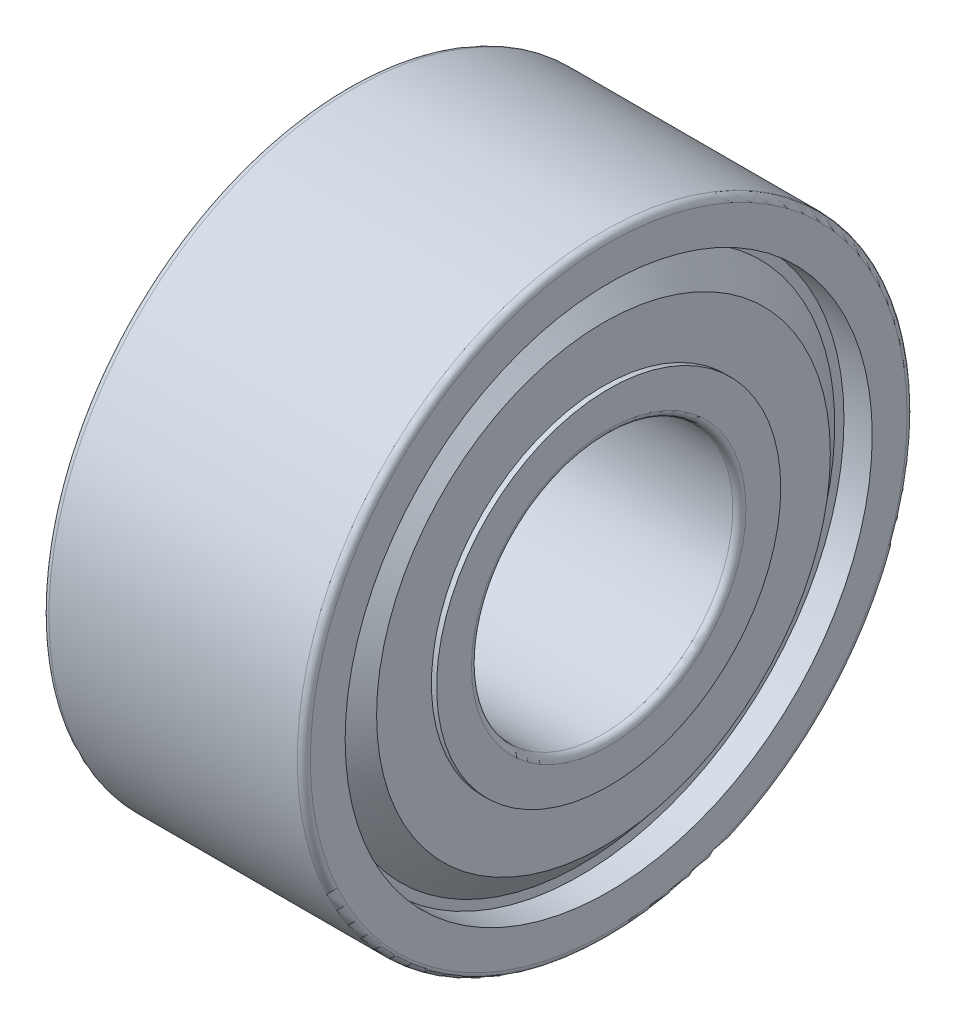
ISO-10303-21;
HEADER;
FILE_DESCRIPTION(('STEP AP214'),'2;1');
FILE_NAME('part.step','',(''),(''),'','','');
FILE_SCHEMA(('AUTOMOTIVE_DESIGN { 1 0 10303 214 1 1 1 1 }'));
ENDSEC;
DATA;
#1=APPLICATION_CONTEXT('core data for automotive mechanical design processes');
#2=APPLICATION_PROTOCOL_DEFINITION('international standard','automotive_design',2000,#1);
#3=PRODUCT_CONTEXT('',#1,'mechanical');
#4=PRODUCT('Part','Part','',(#3));
#5=PRODUCT_RELATED_PRODUCT_CATEGORY('part','',(#4));
#6=PRODUCT_DEFINITION_FORMATION('','',#4);
#7=PRODUCT_DEFINITION_CONTEXT('part definition',#1,'design');
#8=PRODUCT_DEFINITION('design','',#6,#7);
#9=PRODUCT_DEFINITION_SHAPE('','',#8);
#10=(LENGTH_UNIT() NAMED_UNIT(*) SI_UNIT(.MILLI.,.METRE.));
#11=(NAMED_UNIT(*) PLANE_ANGLE_UNIT() SI_UNIT($,.RADIAN.));
#12=(NAMED_UNIT(*) SI_UNIT($,.STERADIAN.) SOLID_ANGLE_UNIT());
#13=UNCERTAINTY_MEASURE_WITH_UNIT(LENGTH_MEASURE(1.E-05),#10,'distance_accuracy_value','');
#14=(GEOMETRIC_REPRESENTATION_CONTEXT(3) GLOBAL_UNCERTAINTY_ASSIGNED_CONTEXT((#13)) GLOBAL_UNIT_ASSIGNED_CONTEXT((#10,
#11,#12)) REPRESENTATION_CONTEXT('',''));
#15=CARTESIAN_POINT('',(0.,0.,0.));
#16=DIRECTION('',(0.,0.,1.));
#17=DIRECTION('',(1.,0.,0.));
#18=AXIS2_PLACEMENT_3D('',#15,#16,#17);
#19=CARTESIAN_POINT('',(0.,-0.5563023348908,2.437319780455));
#20=DIRECTION('',(0.,0.222520933956306,-0.974927912181826));
#21=DIRECTION('',(0.,0.974927912181826,0.222520933956306));
#22=AXIS2_PLACEMENT_3D('',#19,#20,#21);
#23=SPHERICAL_SURFACE('',#22,0.75);
#24=CARTESIAN_POINT('',(0.,-0.389411634423571,1.70612384631863));
#25=VERTEX_POINT('',#24);
#26=VERTEX_LOOP('',#25);
#27=FACE_BOUND('',#26,.T.);
#28=CARTESIAN_POINT('',(0.,-0.723193035358029,3.16851571459137));
#29=VERTEX_POINT('',#28);
#30=VERTEX_LOOP('',#29);
#31=FACE_BOUND('',#30,.T.);
#32=ADVANCED_FACE('P0_F15',(#27,#31),#23,.T.);
#33=CLOSED_SHELL('',(#32));
#34=MANIFOLD_SOLID_BREP('P0_B1',#33);
#35=CARTESIAN_POINT('',(0.,-0.5563023348908,-2.437319780455));
#36=DIRECTION('',(0.,0.222520933956306,0.974927912181826));
#37=DIRECTION('',(0.,-0.974927912181826,0.222520933956306));
#38=AXIS2_PLACEMENT_3D('',#35,#36,#37);
#39=SPHERICAL_SURFACE('',#38,0.75);
#40=CARTESIAN_POINT('',(0.,-0.389411634423571,-1.70612384631863));
#41=VERTEX_POINT('',#40);
#42=VERTEX_LOOP('',#41);
#43=FACE_BOUND('',#42,.T.);
#44=CARTESIAN_POINT('',(0.,-0.723193035358029,-3.16851571459137));
#45=VERTEX_POINT('',#44);
#46=VERTEX_LOOP('',#45);
#47=FACE_BOUND('',#46,.T.);
#48=ADVANCED_FACE('P1_F15',(#43,#47),#39,.T.);
#49=CLOSED_SHELL('',(#48));
#50=MANIFOLD_SOLID_BREP('P1_B1',#49);
#51=CARTESIAN_POINT('',(0.,2.5,0.));
#52=DIRECTION('',(0.,-1.,0.));
#53=DIRECTION('',(0.,0.,-1.));
#54=AXIS2_PLACEMENT_3D('',#51,#52,#53);
#55=SPHERICAL_SURFACE('',#54,0.75);
#56=CARTESIAN_POINT('',(0.,1.75,0.));
#57=VERTEX_POINT('',#56);
#58=VERTEX_LOOP('',#57);
#59=FACE_BOUND('',#58,.T.);
#60=CARTESIAN_POINT('',(0.,3.25,0.));
#61=VERTEX_POINT('',#60);
#62=VERTEX_LOOP('',#61);
#63=FACE_BOUND('',#62,.T.);
#64=ADVANCED_FACE('P2_F15',(#59,#63),#55,.T.);
#65=CLOSED_SHELL('',(#64));
#66=MANIFOLD_SOLID_BREP('P2_B1',#65);
#67=CARTESIAN_POINT('',(0.,-2.252422169756,-1.084709347794));
#68=DIRECTION('',(0.,0.900968867902399,0.4338837391176));
#69=DIRECTION('',(0.,-0.4338837391176,0.900968867902399));
#70=AXIS2_PLACEMENT_3D('',#67,#68,#69);
#71=SPHERICAL_SURFACE('',#70,0.75);
#72=CARTESIAN_POINT('',(0.,-1.5766955188292,-0.7592965434558));
#73=VERTEX_POINT('',#72);
#74=VERTEX_LOOP('',#73);
#75=FACE_BOUND('',#74,.T.);
#76=CARTESIAN_POINT('',(0.,-2.9281488206828,-1.4101221521322));
#77=VERTEX_POINT('',#76);
#78=VERTEX_LOOP('',#77);
#79=FACE_BOUND('',#78,.T.);
#80=ADVANCED_FACE('P3_F15',(#75,#79),#71,.T.);
#81=CLOSED_SHELL('',(#80));
#82=MANIFOLD_SOLID_BREP('P3_B1',#81);
#83=CARTESIAN_POINT('',(0.,1.558724504647,-1.95457870617));
#84=DIRECTION('',(0.,-0.623489801858728,0.781831482468035));
#85=DIRECTION('',(0.,-0.781831482468035,-0.623489801858728));
#86=AXIS2_PLACEMENT_3D('',#83,#84,#85);
#87=SPHERICAL_SURFACE('',#86,0.75);
#88=CARTESIAN_POINT('',(0.,1.09110715325295,-1.36820509431897));
#89=VERTEX_POINT('',#88);
#90=VERTEX_LOOP('',#89);
#91=FACE_BOUND('',#90,.T.);
#92=CARTESIAN_POINT('',(0.,2.02634185604105,-2.54095231802103));
#93=VERTEX_POINT('',#92);
#94=VERTEX_LOOP('',#93);
#95=FACE_BOUND('',#94,.T.);
#96=ADVANCED_FACE('P4_F15',(#91,#95),#87,.T.);
#97=CLOSED_SHELL('',(#96));
#98=MANIFOLD_SOLID_BREP('P4_B1',#97);
#99=CARTESIAN_POINT('',(0.,1.558724504647,1.95457870617));
#100=DIRECTION('',(0.,-0.623489801858728,-0.781831482468035));
#101=DIRECTION('',(0.,0.781831482468035,-0.623489801858728));
#102=AXIS2_PLACEMENT_3D('',#99,#100,#101);
#103=SPHERICAL_SURFACE('',#102,0.75);
#104=CARTESIAN_POINT('',(0.,1.09110715325295,1.36820509431897));
#105=VERTEX_POINT('',#104);
#106=VERTEX_LOOP('',#105);
#107=FACE_BOUND('',#106,.T.);
#108=CARTESIAN_POINT('',(0.,2.02634185604105,2.54095231802103));
#109=VERTEX_POINT('',#108);
#110=VERTEX_LOOP('',#109);
#111=FACE_BOUND('',#110,.T.);
#112=ADVANCED_FACE('P5_F15',(#107,#111),#103,.T.);
#113=CLOSED_SHELL('',(#112));
#114=MANIFOLD_SOLID_BREP('P5_B1',#113);
#115=CARTESIAN_POINT('',(-1.65,0.,0.));
#116=DIRECTION('',(1.,0.,0.));
#117=DIRECTION('',(0.,0.,-1.));
#118=AXIS2_PLACEMENT_3D('',#115,#116,#117);
#119=CYLINDRICAL_SURFACE('',#118,1.5);
#120=CARTESIAN_POINT('',(1.425,0.,0.));
#121=DIRECTION('',(1.,0.,0.));
#122=DIRECTION('',(0.,-1.,0.));
#123=AXIS2_PLACEMENT_3D('',#120,#121,#122);
#124=CIRCLE('',#123,1.5);
#125=CARTESIAN_POINT('',(1.425,-1.5,0.));
#126=VERTEX_POINT('',#125);
#127=EDGE_CURVE('P6_E66',#126,#126,#124,.F.);
#128=ORIENTED_EDGE('',*,*,#127,.F.);
#129=EDGE_LOOP('',(#128));
#130=FACE_BOUND('',#129,.T.);
#131=CARTESIAN_POINT('',(-1.425,0.,0.));
#132=DIRECTION('',(1.,0.,0.));
#133=DIRECTION('',(0.,-1.,0.));
#134=AXIS2_PLACEMENT_3D('',#131,#132,#133);
#135=CIRCLE('',#134,1.5);
#136=CARTESIAN_POINT('',(-1.425,-1.5,0.));
#137=VERTEX_POINT('',#136);
#138=EDGE_CURVE('P6_E128',#137,#137,#135,.T.);
#139=ORIENTED_EDGE('',*,*,#138,.F.);
#140=EDGE_LOOP('',(#139));
#141=FACE_BOUND('',#140,.T.);
#142=ADVANCED_FACE('P6_F17',(#130,#141),#119,.F.);
#143=CARTESIAN_POINT('',(-1.425,0.,0.));
#144=DIRECTION('',(1.,0.,0.));
#145=DIRECTION('',(0.,-1.,0.));
#146=AXIS2_PLACEMENT_3D('',#143,#144,#145);
#147=TOROIDAL_SURFACE('',#146,1.575,0.075);
#148=ORIENTED_EDGE('',*,*,#138,.T.);
#149=EDGE_LOOP('',(#148));
#150=FACE_BOUND('',#149,.T.);
#151=CARTESIAN_POINT('',(-1.5,0.,0.));
#152=DIRECTION('',(-1.,0.,0.));
#153=DIRECTION('',(0.,1.,0.));
#154=AXIS2_PLACEMENT_3D('',#151,#152,#153);
#155=CIRCLE('',#154,1.575);
#156=CARTESIAN_POINT('',(-1.5,1.575,0.));
#157=VERTEX_POINT('',#156);
#158=CARTESIAN_POINT('',(-1.5,-1.575,0.));
#159=VERTEX_POINT('',#158);
#160=EDGE_CURVE('P6_E55',#157,#159,#155,.T.);
#161=ORIENTED_EDGE('',*,*,#160,.T.);
#162=CARTESIAN_POINT('',(-1.5,0.,0.));
#163=DIRECTION('',(-1.,0.,0.));
#164=DIRECTION('',(0.,-1.,0.));
#165=AXIS2_PLACEMENT_3D('',#162,#163,#164);
#166=CIRCLE('',#165,1.575);
#167=EDGE_CURVE('P6_E53',#159,#157,#166,.T.);
#168=ORIENTED_EDGE('',*,*,#167,.T.);
#169=EDGE_LOOP('',(#161,#168));
#170=FACE_BOUND('',#169,.T.);
#171=ADVANCED_FACE('P6_F57',(#150,#170),#147,.T.);
#172=CARTESIAN_POINT('',(1.425,0.,0.));
#173=DIRECTION('',(1.,0.,0.));
#174=DIRECTION('',(0.,-1.,0.));
#175=AXIS2_PLACEMENT_3D('',#172,#173,#174);
#176=TOROIDAL_SURFACE('',#175,1.575,0.075);
#177=CARTESIAN_POINT('',(1.5,0.,0.));
#178=DIRECTION('',(1.,0.,0.));
#179=DIRECTION('',(0.,1.,0.));
#180=AXIS2_PLACEMENT_3D('',#177,#178,#179);
#181=CIRCLE('',#180,1.575);
#182=CARTESIAN_POINT('',(1.5,-1.575,0.));
#183=VERTEX_POINT('',#182);
#184=CARTESIAN_POINT('',(1.5,1.575,0.));
#185=VERTEX_POINT('',#184);
#186=EDGE_CURVE('P6_E60',#183,#185,#181,.F.);
#187=ORIENTED_EDGE('',*,*,#186,.F.);
#188=CARTESIAN_POINT('',(1.5,0.,0.));
#189=DIRECTION('',(1.,0.,0.));
#190=DIRECTION('',(0.,-1.,0.));
#191=AXIS2_PLACEMENT_3D('',#188,#189,#190);
#192=CIRCLE('',#191,1.575);
#193=EDGE_CURVE('P6_E104',#185,#183,#192,.F.);
#194=ORIENTED_EDGE('',*,*,#193,.F.);
#195=EDGE_LOOP('',(#187,#194));
#196=FACE_BOUND('',#195,.T.);
#197=ORIENTED_EDGE('',*,*,#127,.T.);
#198=EDGE_LOOP('',(#197));
#199=FACE_BOUND('',#198,.T.);
#200=ADVANCED_FACE('P6_F86',(#196,#199),#176,.T.);
#201=CARTESIAN_POINT('',(-1.5,0.,0.));
#202=DIRECTION('',(1.,0.,0.));
#203=DIRECTION('',(0.,0.,-1.));
#204=AXIS2_PLACEMENT_3D('',#201,#202,#203);
#205=PLANE('',#204);
#206=ORIENTED_EDGE('',*,*,#167,.F.);
#207=ORIENTED_EDGE('',*,*,#160,.F.);
#208=EDGE_LOOP('',(#206,#207));
#209=FACE_BOUND('',#208,.T.);
#210=CARTESIAN_POINT('',(-1.5,0.,0.));
#211=DIRECTION('',(1.,0.,0.));
#212=DIRECTION('',(0.,0.,-1.));
#213=AXIS2_PLACEMENT_3D('',#210,#211,#212);
#214=CIRCLE('',#213,1.975);
#215=CARTESIAN_POINT('',(-1.5,0.,-1.975));
#216=VERTEX_POINT('',#215);
#217=EDGE_CURVE('P6_E165',#216,#216,#214,.T.);
#218=ORIENTED_EDGE('',*,*,#217,.F.);
#219=EDGE_LOOP('',(#218));
#220=FACE_BOUND('',#219,.T.);
#221=ADVANCED_FACE('P6_F64',(#209,#220),#205,.F.);
#222=CARTESIAN_POINT('',(1.5,0.,0.));
#223=DIRECTION('',(1.,0.,0.));
#224=DIRECTION('',(0.,0.,-1.));
#225=AXIS2_PLACEMENT_3D('',#222,#223,#224);
#226=PLANE('',#225);
#227=ORIENTED_EDGE('',*,*,#186,.T.);
#228=ORIENTED_EDGE('',*,*,#193,.T.);
#229=EDGE_LOOP('',(#227,#228));
#230=FACE_BOUND('',#229,.T.);
#231=CARTESIAN_POINT('',(1.5,0.,0.));
#232=DIRECTION('',(1.,0.,0.));
#233=DIRECTION('',(0.,0.,-1.));
#234=AXIS2_PLACEMENT_3D('',#231,#232,#233);
#235=CIRCLE('',#234,1.975);
#236=CARTESIAN_POINT('',(1.5,0.,-1.975));
#237=VERTEX_POINT('',#236);
#238=EDGE_CURVE('P6_E162',#237,#237,#235,.F.);
#239=ORIENTED_EDGE('',*,*,#238,.F.);
#240=EDGE_LOOP('',(#239));
#241=FACE_BOUND('',#240,.T.);
#242=ADVANCED_FACE('P6_F85',(#230,#241),#226,.T.);
#243=CARTESIAN_POINT('',(-1.65,0.,0.));
#244=DIRECTION('',(1.,0.,0.));
#245=DIRECTION('',(0.,0.,-1.));
#246=AXIS2_PLACEMENT_3D('',#243,#244,#245);
#247=CYLINDRICAL_SURFACE('',#246,1.975);
#248=ORIENTED_EDGE('',*,*,#217,.T.);
#249=EDGE_LOOP('',(#248));
#250=FACE_BOUND('',#249,.T.);
#251=CARTESIAN_POINT('',(-1.44,0.,0.));
#252=DIRECTION('',(1.,0.,0.));
#253=DIRECTION('',(0.,0.,-1.));
#254=AXIS2_PLACEMENT_3D('',#251,#252,#253);
#255=CIRCLE('',#254,1.975);
#256=CARTESIAN_POINT('',(-1.44,0.,-1.975));
#257=VERTEX_POINT('',#256);
#258=EDGE_CURVE('P6_E159',#257,#257,#255,.F.);
#259=ORIENTED_EDGE('',*,*,#258,.T.);
#260=EDGE_LOOP('',(#259));
#261=FACE_BOUND('',#260,.T.);
#262=ADVANCED_FACE('P6_F293',(#250,#261),#247,.T.);
#263=CARTESIAN_POINT('',(-1.65,0.,0.));
#264=DIRECTION('',(1.,0.,0.));
#265=DIRECTION('',(0.,0.,-1.));
#266=AXIS2_PLACEMENT_3D('',#263,#264,#265);
#267=CYLINDRICAL_SURFACE('',#266,1.975);
#268=ORIENTED_EDGE('',*,*,#238,.T.);
#269=EDGE_LOOP('',(#268));
#270=FACE_BOUND('',#269,.T.);
#271=CARTESIAN_POINT('',(1.44,0.,0.));
#272=DIRECTION('',(1.,0.,0.));
#273=DIRECTION('',(0.,0.,-1.));
#274=AXIS2_PLACEMENT_3D('',#271,#272,#273);
#275=CIRCLE('',#274,1.975);
#276=CARTESIAN_POINT('',(1.44,0.,-1.975));
#277=VERTEX_POINT('',#276);
#278=EDGE_CURVE('P6_E156',#277,#277,#275,.F.);
#279=ORIENTED_EDGE('',*,*,#278,.F.);
#280=EDGE_LOOP('',(#279));
#281=FACE_BOUND('',#280,.T.);
#282=ADVANCED_FACE('P6_F296',(#270,#281),#267,.T.);
#283=CARTESIAN_POINT('',(-1.44,0.,0.));
#284=DIRECTION('',(1.,0.,0.));
#285=DIRECTION('',(0.,0.,-1.));
#286=AXIS2_PLACEMENT_3D('',#283,#284,#285);
#287=PLANE('',#286);
#288=ORIENTED_EDGE('',*,*,#258,.F.);
#289=EDGE_LOOP('',(#288));
#290=FACE_BOUND('',#289,.T.);
#291=CARTESIAN_POINT('',(-1.43999999994548,0.,0.));
#292=DIRECTION('',(1.,0.,0.));
#293=DIRECTION('',(0.,0.,-1.));
#294=AXIS2_PLACEMENT_3D('',#291,#292,#293);
#295=CIRCLE('',#294,2.60400000001937);
#296=CARTESIAN_POINT('',(-1.43999999994548,0.,-2.60400000001937));
#297=VERTEX_POINT('',#296);
#298=EDGE_CURVE('P6_E153',#297,#297,#295,.T.);
#299=ORIENTED_EDGE('',*,*,#298,.F.);
#300=EDGE_LOOP('',(#299));
#301=FACE_BOUND('',#300,.T.);
#302=ADVANCED_FACE('P6_F299',(#290,#301),#287,.F.);
#303=CARTESIAN_POINT('',(1.44,0.,0.));
#304=DIRECTION('',(1.,0.,0.));
#305=DIRECTION('',(0.,0.,-1.));
#306=AXIS2_PLACEMENT_3D('',#303,#304,#305);
#307=PLANE('',#306);
#308=ORIENTED_EDGE('',*,*,#278,.T.);
#309=EDGE_LOOP('',(#308));
#310=FACE_BOUND('',#309,.T.);
#311=CARTESIAN_POINT('',(1.43999999994548,0.,0.));
#312=DIRECTION('',(-1.,0.,0.));
#313=DIRECTION('',(0.,0.,1.));
#314=AXIS2_PLACEMENT_3D('',#311,#312,#313);
#315=CIRCLE('',#314,2.60400000001937);
#316=CARTESIAN_POINT('',(1.43999999994548,0.,2.60400000001937));
#317=VERTEX_POINT('',#316);
#318=EDGE_CURVE('P6_E150',#317,#317,#315,.T.);
#319=ORIENTED_EDGE('',*,*,#318,.F.);
#320=EDGE_LOOP('',(#319));
#321=FACE_BOUND('',#320,.T.);
#322=ADVANCED_FACE('P6_F303',(#310,#321),#307,.T.);
#323=CARTESIAN_POINT('',(-1.17557872869156,0.,0.));
#324=DIRECTION('',(1.,0.,0.));
#325=DIRECTION('',(0.,0.,-1.));
#326=AXIS2_PLACEMENT_3D('',#323,#324,#325);
#327=CONICAL_SURFACE('',#326,2.91912500000535,0.872664626014028);
#328=ORIENTED_EDGE('',*,*,#298,.T.);
#329=EDGE_LOOP('',(#328));
#330=FACE_BOUND('',#329,.T.);
#331=CARTESIAN_POINT('',(-1.17557872869156,0.,0.));
#332=DIRECTION('',(1.,0.,0.));
#333=DIRECTION('',(0.,0.,-1.));
#334=AXIS2_PLACEMENT_3D('',#331,#332,#333);
#335=CIRCLE('',#334,2.91912500000535);
#336=CARTESIAN_POINT('',(-1.17557872869156,0.,-2.91912500000535));
#337=VERTEX_POINT('',#336);
#338=EDGE_CURVE('P6_E147',#337,#337,#335,.F.);
#339=ORIENTED_EDGE('',*,*,#338,.T.);
#340=EDGE_LOOP('',(#339));
#341=FACE_BOUND('',#340,.T.);
#342=ADVANCED_FACE('P6_F306',(#330,#341),#327,.T.);
#343=CARTESIAN_POINT('',(1.17557872869156,0.,0.));
#344=DIRECTION('',(-1.,0.,0.));
#345=DIRECTION('',(0.,0.,1.));
#346=AXIS2_PLACEMENT_3D('',#343,#344,#345);
#347=CONICAL_SURFACE('',#346,2.91912500000535,0.872664626014028);
#348=CARTESIAN_POINT('',(1.17557872869156,0.,0.));
#349=DIRECTION('',(-1.,0.,0.));
#350=DIRECTION('',(0.,0.,1.));
#351=AXIS2_PLACEMENT_3D('',#348,#349,#350);
#352=CIRCLE('',#351,2.91912500000535);
#353=CARTESIAN_POINT('',(1.17557872869156,0.,2.91912500000535));
#354=VERTEX_POINT('',#353);
#355=EDGE_CURVE('P6_E144',#354,#354,#352,.T.);
#356=ORIENTED_EDGE('',*,*,#355,.F.);
#357=EDGE_LOOP('',(#356));
#358=FACE_BOUND('',#357,.T.);
#359=ORIENTED_EDGE('',*,*,#318,.T.);
#360=EDGE_LOOP('',(#359));
#361=FACE_BOUND('',#360,.T.);
#362=ADVANCED_FACE('P6_F310',(#358,#361),#347,.T.);
#363=CARTESIAN_POINT('',(-1.175578728725,0.,0.));
#364=DIRECTION('',(1.,0.,0.));
#365=DIRECTION('',(0.,0.,-1.));
#366=AXIS2_PLACEMENT_3D('',#363,#364,#365);
#367=PLANE('',#366);
#368=ORIENTED_EDGE('',*,*,#338,.F.);
#369=EDGE_LOOP('',(#368));
#370=FACE_BOUND('',#369,.T.);
#371=CARTESIAN_POINT('',(-1.175578728725,0.,0.));
#372=DIRECTION('',(1.,0.,0.));
#373=DIRECTION('',(0.,0.,-1.));
#374=AXIS2_PLACEMENT_3D('',#371,#372,#373);
#375=CIRCLE('',#374,3.025);
#376=CARTESIAN_POINT('',(-1.175578728725,0.,-3.025));
#377=VERTEX_POINT('',#376);
#378=EDGE_CURVE('P6_E141',#377,#377,#375,.F.);
#379=ORIENTED_EDGE('',*,*,#378,.T.);
#380=EDGE_LOOP('',(#379));
#381=FACE_BOUND('',#380,.T.);
#382=ADVANCED_FACE('P6_F312',(#370,#381),#367,.F.);
#383=CARTESIAN_POINT('',(1.175578728725,0.,0.));
#384=DIRECTION('',(1.,0.,0.));
#385=DIRECTION('',(0.,0.,-1.));
#386=AXIS2_PLACEMENT_3D('',#383,#384,#385);
#387=PLANE('',#386);
#388=ORIENTED_EDGE('',*,*,#355,.T.);
#389=EDGE_LOOP('',(#388));
#390=FACE_BOUND('',#389,.T.);
#391=CARTESIAN_POINT('',(1.175578728725,0.,0.));
#392=DIRECTION('',(1.,0.,0.));
#393=DIRECTION('',(0.,0.,-1.));
#394=AXIS2_PLACEMENT_3D('',#391,#392,#393);
#395=CIRCLE('',#394,3.025);
#396=CARTESIAN_POINT('',(1.175578728725,0.,-3.025));
#397=VERTEX_POINT('',#396);
#398=EDGE_CURVE('P6_E138',#397,#397,#395,.T.);
#399=ORIENTED_EDGE('',*,*,#398,.T.);
#400=EDGE_LOOP('',(#399));
#401=FACE_BOUND('',#400,.T.);
#402=ADVANCED_FACE('P6_F320',(#390,#401),#387,.T.);
#403=CARTESIAN_POINT('',(-1.65,0.,0.));
#404=DIRECTION('',(1.,0.,0.));
#405=DIRECTION('',(0.,0.,-1.));
#406=AXIS2_PLACEMENT_3D('',#403,#404,#405);
#407=CYLINDRICAL_SURFACE('',#406,3.025);
#408=CARTESIAN_POINT('',(-1.5,0.,0.));
#409=DIRECTION('',(1.,0.,0.));
#410=DIRECTION('',(0.,0.,-1.));
#411=AXIS2_PLACEMENT_3D('',#408,#409,#410);
#412=CIRCLE('',#411,3.025);
#413=CARTESIAN_POINT('',(-1.5,0.,-3.025));
#414=VERTEX_POINT('',#413);
#415=EDGE_CURVE('P6_E135',#414,#414,#412,.F.);
#416=ORIENTED_EDGE('',*,*,#415,.T.);
#417=EDGE_LOOP('',(#416));
#418=FACE_BOUND('',#417,.T.);
#419=ORIENTED_EDGE('',*,*,#378,.F.);
#420=EDGE_LOOP('',(#419));
#421=FACE_BOUND('',#420,.T.);
#422=ADVANCED_FACE('P6_F552',(#418,#421),#407,.F.);
#423=CARTESIAN_POINT('',(-1.65,0.,0.));
#424=DIRECTION('',(1.,0.,0.));
#425=DIRECTION('',(0.,0.,-1.));
#426=AXIS2_PLACEMENT_3D('',#423,#424,#425);
#427=CYLINDRICAL_SURFACE('',#426,3.025);
#428=CARTESIAN_POINT('',(1.5,0.,0.));
#429=DIRECTION('',(1.,0.,0.));
#430=DIRECTION('',(0.,0.,-1.));
#431=AXIS2_PLACEMENT_3D('',#428,#429,#430);
#432=CIRCLE('',#431,3.025);
#433=CARTESIAN_POINT('',(1.5,0.,-3.025));
#434=VERTEX_POINT('',#433);
#435=EDGE_CURVE('P6_E132',#434,#434,#432,.F.);
#436=ORIENTED_EDGE('',*,*,#435,.F.);
#437=EDGE_LOOP('',(#436));
#438=FACE_BOUND('',#437,.T.);
#439=ORIENTED_EDGE('',*,*,#398,.F.);
#440=EDGE_LOOP('',(#439));
#441=FACE_BOUND('',#440,.T.);
#442=ADVANCED_FACE('P6_F563',(#438,#441),#427,.F.);
#443=CARTESIAN_POINT('',(-1.5,0.,0.));
#444=DIRECTION('',(1.,0.,0.));
#445=DIRECTION('',(0.,0.,-1.));
#446=AXIS2_PLACEMENT_3D('',#443,#444,#445);
#447=PLANE('',#446);
#448=ORIENTED_EDGE('',*,*,#415,.F.);
#449=EDGE_LOOP('',(#448));
#450=FACE_BOUND('',#449,.T.);
#451=CARTESIAN_POINT('',(-1.5,0.,0.));
#452=DIRECTION('',(1.,0.,0.));
#453=DIRECTION('',(0.,-1.,0.));
#454=AXIS2_PLACEMENT_3D('',#451,#452,#453);
#455=CIRCLE('',#454,3.425);
#456=CARTESIAN_POINT('',(-1.5,-3.425,0.));
#457=VERTEX_POINT('',#456);
#458=CARTESIAN_POINT('',(-1.5,3.425,0.));
#459=VERTEX_POINT('',#458);
#460=EDGE_CURVE('P6_E252',#457,#459,#455,.T.);
#461=ORIENTED_EDGE('',*,*,#460,.F.);
#462=CARTESIAN_POINT('',(-1.5,0.,0.));
#463=DIRECTION('',(1.,0.,0.));
#464=DIRECTION('',(0.,1.,0.));
#465=AXIS2_PLACEMENT_3D('',#462,#463,#464);
#466=CIRCLE('',#465,3.425);
#467=EDGE_CURVE('P6_E263',#459,#457,#466,.T.);
#468=ORIENTED_EDGE('',*,*,#467,.F.);
#469=EDGE_LOOP('',(#461,#468));
#470=FACE_BOUND('',#469,.T.);
#471=ADVANCED_FACE('P6_F226',(#450,#470),#447,.F.);
#472=CARTESIAN_POINT('',(1.5,0.,0.));
#473=DIRECTION('',(1.,0.,0.));
#474=DIRECTION('',(0.,0.,-1.));
#475=AXIS2_PLACEMENT_3D('',#472,#473,#474);
#476=PLANE('',#475);
#477=ORIENTED_EDGE('',*,*,#435,.T.);
#478=EDGE_LOOP('',(#477));
#479=FACE_BOUND('',#478,.T.);
#480=CARTESIAN_POINT('',(1.5,0.,0.));
#481=DIRECTION('',(-1.,0.,0.));
#482=DIRECTION('',(0.,1.,0.));
#483=AXIS2_PLACEMENT_3D('',#480,#481,#482);
#484=CIRCLE('',#483,3.425);
#485=CARTESIAN_POINT('',(1.5,3.425,0.));
#486=VERTEX_POINT('',#485);
#487=CARTESIAN_POINT('',(1.5,-3.425,0.));
#488=VERTEX_POINT('',#487);
#489=EDGE_CURVE('P6_E35',#486,#488,#484,.T.);
#490=ORIENTED_EDGE('',*,*,#489,.F.);
#491=CARTESIAN_POINT('',(1.5,0.,0.));
#492=DIRECTION('',(-1.,0.,0.));
#493=DIRECTION('',(0.,-1.,0.));
#494=AXIS2_PLACEMENT_3D('',#491,#492,#493);
#495=CIRCLE('',#494,3.425);
#496=EDGE_CURVE('P6_E239',#488,#486,#495,.T.);
#497=ORIENTED_EDGE('',*,*,#496,.F.);
#498=EDGE_LOOP('',(#490,#497));
#499=FACE_BOUND('',#498,.T.);
#500=ADVANCED_FACE('P6_F217',(#479,#499),#476,.T.);
#501=CARTESIAN_POINT('',(-1.425,0.,0.));
#502=DIRECTION('',(1.,0.,0.));
#503=DIRECTION('',(0.,-1.,0.));
#504=AXIS2_PLACEMENT_3D('',#501,#502,#503);
#505=TOROIDAL_SURFACE('',#504,3.425,0.075);
#506=CARTESIAN_POINT('',(-1.425,0.,0.));
#507=DIRECTION('',(1.,0.,0.));
#508=DIRECTION('',(0.,0.,-1.));
#509=AXIS2_PLACEMENT_3D('',#506,#507,#508);
#510=CIRCLE('',#509,3.5);
#511=CARTESIAN_POINT('',(-1.425,0.,-3.5));
#512=VERTEX_POINT('',#511);
#513=EDGE_CURVE('P6_E27',#512,#512,#510,.T.);
#514=ORIENTED_EDGE('',*,*,#513,.F.);
#515=EDGE_LOOP('',(#514));
#516=FACE_BOUND('',#515,.T.);
#517=ORIENTED_EDGE('',*,*,#467,.T.);
#518=ORIENTED_EDGE('',*,*,#460,.T.);
#519=EDGE_LOOP('',(#517,#518));
#520=FACE_BOUND('',#519,.T.);
#521=ADVANCED_FACE('P6_F201',(#516,#520),#505,.T.);
#522=CARTESIAN_POINT('',(1.425,0.,0.));
#523=DIRECTION('',(1.,0.,0.));
#524=DIRECTION('',(0.,-1.,0.));
#525=AXIS2_PLACEMENT_3D('',#522,#523,#524);
#526=TOROIDAL_SURFACE('',#525,3.425,0.075);
#527=ORIENTED_EDGE('',*,*,#489,.T.);
#528=ORIENTED_EDGE('',*,*,#496,.T.);
#529=EDGE_LOOP('',(#527,#528));
#530=FACE_BOUND('',#529,.T.);
#531=CARTESIAN_POINT('',(1.425,0.,0.));
#532=DIRECTION('',(1.,0.,0.));
#533=DIRECTION('',(0.,0.,-1.));
#534=AXIS2_PLACEMENT_3D('',#531,#532,#533);
#535=CIRCLE('',#534,3.5);
#536=CARTESIAN_POINT('',(1.425,0.,-3.5));
#537=VERTEX_POINT('',#536);
#538=EDGE_CURVE('P6_E11',#537,#537,#535,.F.);
#539=ORIENTED_EDGE('',*,*,#538,.F.);
#540=EDGE_LOOP('',(#539));
#541=FACE_BOUND('',#540,.T.);
#542=ADVANCED_FACE('P6_F189',(#530,#541),#526,.T.);
#543=CARTESIAN_POINT('',(-1.65,0.,0.));
#544=DIRECTION('',(1.,0.,0.));
#545=DIRECTION('',(0.,0.,-1.));
#546=AXIS2_PLACEMENT_3D('',#543,#544,#545);
#547=CYLINDRICAL_SURFACE('',#546,3.5);
#548=ORIENTED_EDGE('',*,*,#538,.T.);
#549=EDGE_LOOP('',(#548));
#550=FACE_BOUND('',#549,.T.);
#551=ORIENTED_EDGE('',*,*,#513,.T.);
#552=EDGE_LOOP('',(#551));
#553=FACE_BOUND('',#552,.T.);
#554=ADVANCED_FACE('P6_F200',(#550,#553),#547,.T.);
#555=CLOSED_SHELL('',(#142,#171,#200,#221,#242,#262,#282,#302,#322,#342,#362,#382,#402,#422,
#442,#471,#500,#521,#542,#554));
#556=CARTESIAN_POINT('',(-1.100578728725,0.,0.));
#557=DIRECTION('',(1.,0.,0.));
#558=DIRECTION('',(0.,0.,-1.));
#559=AXIS2_PLACEMENT_3D('',#556,#557,#558);
#560=PLANE('',#559);
#561=CARTESIAN_POINT('',(-1.100578728725,0.,0.));
#562=DIRECTION('',(1.,0.,0.));
#563=DIRECTION('',(0.,0.,-1.));
#564=AXIS2_PLACEMENT_3D('',#561,#562,#563);
#565=CIRCLE('',#564,1.975);
#566=CARTESIAN_POINT('',(-1.100578728725,0.,-1.975));
#567=VERTEX_POINT('',#566);
#568=EDGE_CURVE('P6_E174',#567,#567,#565,.T.);
#569=ORIENTED_EDGE('',*,*,#568,.F.);
#570=EDGE_LOOP('',(#569));
#571=FACE_BOUND('',#570,.T.);
#572=CARTESIAN_POINT('',(-1.100578728725,0.,0.));
#573=DIRECTION('',(1.,0.,0.));
#574=DIRECTION('',(0.,0.,-1.));
#575=AXIS2_PLACEMENT_3D('',#572,#573,#574);
#576=CIRCLE('',#575,3.025);
#577=CARTESIAN_POINT('',(-1.100578728725,0.,-3.025));
#578=VERTEX_POINT('',#577);
#579=EDGE_CURVE('P6_E178',#578,#578,#576,.T.);
#580=ORIENTED_EDGE('',*,*,#579,.T.);
#581=EDGE_LOOP('',(#580));
#582=FACE_BOUND('',#581,.T.);
#583=ADVANCED_FACE('P6_F365',(#571,#582),#560,.T.);
#584=CARTESIAN_POINT('',(-1.65,0.,0.));
#585=DIRECTION('',(1.,0.,0.));
#586=DIRECTION('',(0.,0.,-1.));
#587=AXIS2_PLACEMENT_3D('',#584,#585,#586);
#588=CYLINDRICAL_SURFACE('',#587,3.025);
#589=CARTESIAN_POINT('',(-0.535607132140707,0.,0.));
#590=DIRECTION('',(1.,0.,0.));
#591=DIRECTION('',(0.,-1.,0.));
#592=AXIS2_PLACEMENT_3D('',#589,#590,#591);
#593=CIRCLE('',#592,3.02500000000001);
#594=CARTESIAN_POINT('',(-0.535607132140707,-3.02500000000001,0.));
#595=VERTEX_POINT('',#594);
#596=EDGE_CURVE('P6_E177',#595,#595,#593,.T.);
#597=ORIENTED_EDGE('',*,*,#596,.T.);
#598=EDGE_LOOP('',(#597));
#599=FACE_BOUND('',#598,.T.);
#600=ORIENTED_EDGE('',*,*,#579,.F.);
#601=EDGE_LOOP('',(#600));
#602=FACE_BOUND('',#601,.T.);
#603=ADVANCED_FACE('P6_F369',(#599,#602),#588,.F.);
#604=CARTESIAN_POINT('',(-1.65,0.,0.));
#605=DIRECTION('',(1.,0.,0.));
#606=DIRECTION('',(0.,0.,-1.));
#607=AXIS2_PLACEMENT_3D('',#604,#605,#606);
#608=CYLINDRICAL_SURFACE('',#607,1.975);
#609=CARTESIAN_POINT('',(-0.535607132140707,0.,0.));
#610=DIRECTION('',(1.,0.,0.));
#611=DIRECTION('',(0.,-1.,0.));
#612=AXIS2_PLACEMENT_3D('',#609,#610,#611);
#613=CIRCLE('',#612,1.97499999999999);
#614=CARTESIAN_POINT('',(-0.535607132140707,-1.97499999999999,0.));
#615=VERTEX_POINT('',#614);
#616=EDGE_CURVE('P6_E704',#615,#615,#613,.F.);
#617=ORIENTED_EDGE('',*,*,#616,.T.);
#618=EDGE_LOOP('',(#617));
#619=FACE_BOUND('',#618,.T.);
#620=ORIENTED_EDGE('',*,*,#568,.T.);
#621=EDGE_LOOP('',(#620));
#622=FACE_BOUND('',#621,.T.);
#623=ADVANCED_FACE('P6_F380',(#619,#622),#608,.T.);
#624=CARTESIAN_POINT('',(0.,0.,0.));
#625=DIRECTION('',(1.,0.,0.));
#626=DIRECTION('',(0.,-1.,0.));
#627=AXIS2_PLACEMENT_3D('',#624,#625,#626);
#628=TOROIDAL_SURFACE('',#627,2.5,0.75);
#629=CARTESIAN_POINT('',(0.5356071321407,0.,0.));
#630=DIRECTION('',(1.,0.,0.));
#631=DIRECTION('',(0.,0.,-1.));
#632=AXIS2_PLACEMENT_3D('',#629,#630,#631);
#633=CIRCLE('',#632,3.025);
#634=CARTESIAN_POINT('',(0.5356071321407,0.,-3.025));
#635=VERTEX_POINT('',#634);
#636=EDGE_CURVE('P6_E702',#635,#635,#633,.T.);
#637=ORIENTED_EDGE('',*,*,#636,.T.);
#638=EDGE_LOOP('',(#637));
#639=FACE_BOUND('',#638,.T.);
#640=ORIENTED_EDGE('',*,*,#596,.F.);
#641=EDGE_LOOP('',(#640));
#642=FACE_BOUND('',#641,.T.);
#643=ADVANCED_FACE('P6_F391',(#639,#642),#628,.F.);
#644=CARTESIAN_POINT('',(0.,0.,0.));
#645=DIRECTION('',(1.,0.,0.));
#646=DIRECTION('',(0.,-1.,0.));
#647=AXIS2_PLACEMENT_3D('',#644,#645,#646);
#648=TOROIDAL_SURFACE('',#647,2.5,0.75);
#649=ORIENTED_EDGE('',*,*,#616,.F.);
#650=EDGE_LOOP('',(#649));
#651=FACE_BOUND('',#650,.T.);
#652=CARTESIAN_POINT('',(0.5356071321407,0.,0.));
#653=DIRECTION('',(1.,0.,0.));
#654=DIRECTION('',(0.,0.,-1.));
#655=AXIS2_PLACEMENT_3D('',#652,#653,#654);
#656=CIRCLE('',#655,1.975);
#657=CARTESIAN_POINT('',(0.5356071321407,0.,-1.975));
#658=VERTEX_POINT('',#657);
#659=EDGE_CURVE('P6_E173',#658,#658,#656,.T.);
#660=ORIENTED_EDGE('',*,*,#659,.F.);
#661=EDGE_LOOP('',(#660));
#662=FACE_BOUND('',#661,.T.);
#663=ADVANCED_FACE('P6_F402',(#651,#662),#648,.F.);
#664=CARTESIAN_POINT('',(-1.65,0.,0.));
#665=DIRECTION('',(1.,0.,0.));
#666=DIRECTION('',(0.,0.,-1.));
#667=AXIS2_PLACEMENT_3D('',#664,#665,#666);
#668=CYLINDRICAL_SURFACE('',#667,3.025);
#669=ORIENTED_EDGE('',*,*,#636,.F.);
#670=EDGE_LOOP('',(#669));
#671=FACE_BOUND('',#670,.T.);
#672=CARTESIAN_POINT('',(1.100578728725,0.,0.));
#673=DIRECTION('',(1.,0.,0.));
#674=DIRECTION('',(0.,0.,-1.));
#675=AXIS2_PLACEMENT_3D('',#672,#673,#674);
#676=CIRCLE('',#675,3.025);
#677=CARTESIAN_POINT('',(1.100578728725,0.,-3.025));
#678=VERTEX_POINT('',#677);
#679=EDGE_CURVE('P6_E170',#678,#678,#676,.T.);
#680=ORIENTED_EDGE('',*,*,#679,.T.);
#681=EDGE_LOOP('',(#680));
#682=FACE_BOUND('',#681,.T.);
#683=ADVANCED_FACE('P6_F413',(#671,#682),#668,.F.);
#684=CARTESIAN_POINT('',(-1.65,0.,0.));
#685=DIRECTION('',(1.,0.,0.));
#686=DIRECTION('',(0.,0.,-1.));
#687=AXIS2_PLACEMENT_3D('',#684,#685,#686);
#688=CYLINDRICAL_SURFACE('',#687,1.975);
#689=ORIENTED_EDGE('',*,*,#659,.T.);
#690=EDGE_LOOP('',(#689));
#691=FACE_BOUND('',#690,.T.);
#692=CARTESIAN_POINT('',(1.100578728725,0.,0.));
#693=DIRECTION('',(1.,0.,0.));
#694=DIRECTION('',(0.,0.,-1.));
#695=AXIS2_PLACEMENT_3D('',#692,#693,#694);
#696=CIRCLE('',#695,1.975);
#697=CARTESIAN_POINT('',(1.100578728725,0.,-1.975));
#698=VERTEX_POINT('',#697);
#699=EDGE_CURVE('P6_E131',#698,#698,#696,.F.);
#700=ORIENTED_EDGE('',*,*,#699,.T.);
#701=EDGE_LOOP('',(#700));
#702=FACE_BOUND('',#701,.T.);
#703=ADVANCED_FACE('P6_F424',(#691,#702),#688,.T.);
#704=CARTESIAN_POINT('',(1.100578728725,0.,0.));
#705=DIRECTION('',(1.,0.,0.));
#706=DIRECTION('',(0.,0.,-1.));
#707=AXIS2_PLACEMENT_3D('',#704,#705,#706);
#708=PLANE('',#707);
#709=ORIENTED_EDGE('',*,*,#699,.F.);
#710=EDGE_LOOP('',(#709));
#711=FACE_BOUND('',#710,.T.);
#712=ORIENTED_EDGE('',*,*,#679,.F.);
#713=EDGE_LOOP('',(#712));
#714=FACE_BOUND('',#713,.T.);
#715=ADVANCED_FACE('P6_F435',(#711,#714),#708,.F.);
#716=CLOSED_SHELL('',(#583,#603,#623,#643,#663,#683,#703,#715));
#717=ORIENTED_CLOSED_SHELL('',*,#716,.T.);
#718=BREP_WITH_VOIDS('P6_B1',#555,(#717));
#719=CARTESIAN_POINT('',(0.,-2.252422169756,1.084709347794));
#720=DIRECTION('',(0.,0.900968867902399,-0.4338837391176));
#721=DIRECTION('',(0.,0.4338837391176,0.900968867902399));
#722=AXIS2_PLACEMENT_3D('',#719,#720,#721);
#723=SPHERICAL_SURFACE('',#722,0.75);
#724=CARTESIAN_POINT('',(0.,-1.5766955188292,0.759296543455801));
#725=VERTEX_POINT('',#724);
#726=VERTEX_LOOP('',#725);
#727=FACE_BOUND('',#726,.T.);
#728=CARTESIAN_POINT('',(0.,-2.9281488206828,1.4101221521322));
#729=VERTEX_POINT('',#728);
#730=VERTEX_LOOP('',#729);
#731=FACE_BOUND('',#730,.T.);
#732=ADVANCED_FACE('P7_F15',(#727,#731),#723,.T.);
#733=CLOSED_SHELL('',(#732));
#734=MANIFOLD_SOLID_BREP('P7_B1',#733);
#735=ADVANCED_BREP_SHAPE_REPRESENTATION('',(#18,#34,#50,#66,#82,#98,#114,#718,#734),#14);
#736=SHAPE_DEFINITION_REPRESENTATION(#9,#735);
ENDSEC;
END-ISO-10303-21;
